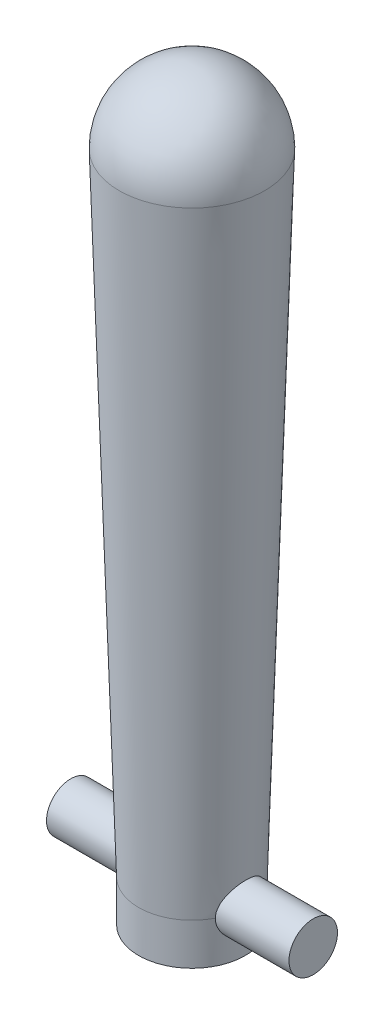
ISO-10303-21;
HEADER;
FILE_DESCRIPTION(('STEP AP214'),'2;1');
FILE_NAME('part.step','',(''),(''),'','','');
FILE_SCHEMA(('AUTOMOTIVE_DESIGN { 1 0 10303 214 1 1 1 1 }'));
ENDSEC;
DATA;
#1=APPLICATION_CONTEXT('core data for automotive mechanical design processes');
#2=APPLICATION_PROTOCOL_DEFINITION('international standard','automotive_design',2000,#1);
#3=PRODUCT_CONTEXT('',#1,'mechanical');
#4=PRODUCT('Part','Part','',(#3));
#5=PRODUCT_RELATED_PRODUCT_CATEGORY('part','',(#4));
#6=PRODUCT_DEFINITION_FORMATION('','',#4);
#7=PRODUCT_DEFINITION_CONTEXT('part definition',#1,'design');
#8=PRODUCT_DEFINITION('design','',#6,#7);
#9=PRODUCT_DEFINITION_SHAPE('','',#8);
#10=(LENGTH_UNIT() NAMED_UNIT(*) SI_UNIT(.MILLI.,.METRE.));
#11=(NAMED_UNIT(*) PLANE_ANGLE_UNIT() SI_UNIT($,.RADIAN.));
#12=(NAMED_UNIT(*) SI_UNIT($,.STERADIAN.) SOLID_ANGLE_UNIT());
#13=UNCERTAINTY_MEASURE_WITH_UNIT(LENGTH_MEASURE(1.E-05),#10,'distance_accuracy_value','');
#14=(GEOMETRIC_REPRESENTATION_CONTEXT(3) GLOBAL_UNCERTAINTY_ASSIGNED_CONTEXT((#13)) GLOBAL_UNIT_ASSIGNED_CONTEXT((#10,
#11,#12)) REPRESENTATION_CONTEXT('',''));
#15=CARTESIAN_POINT('',(0.,0.,0.));
#16=DIRECTION('',(0.,0.,1.));
#17=DIRECTION('',(1.,0.,0.));
#18=AXIS2_PLACEMENT_3D('',#15,#16,#17);
#19=CARTESIAN_POINT('',(0.,13.,0.));
#20=DIRECTION('',(0.,1.,0.));
#21=DIRECTION('',(0.,0.,1.));
#22=AXIS2_PLACEMENT_3D('',#19,#20,#21);
#23=CONICAL_SURFACE('',#22,1.5,0.0307595260704692);
#24=CARTESIAN_POINT('',(0.,0.,0.));
#25=DIRECTION('',(0.,-1.,0.));
#26=DIRECTION('',(0.,0.,-1.));
#27=AXIS2_PLACEMENT_3D('',#24,#25,#26);
#28=CIRCLE('',#27,1.1);
#29=CARTESIAN_POINT('',(0.979795897113271,0.,0.5));
#30=VERTEX_POINT('',#29);
#31=CARTESIAN_POINT('',(-0.979795897113271,0.,0.5));
#32=VERTEX_POINT('',#31);
#33=EDGE_CURVE('E74',#30,#32,#28,.T.);
#34=ORIENTED_EDGE('',*,*,#33,.F.);
#35=CARTESIAN_POINT('',(0.979789008703573,-0.000200000000000052,0.499999959999998));
#36=CARTESIAN_POINT('',(0.980667534677214,0.026673580649546,0.500038231747325));
#37=CARTESIAN_POINT('',(0.982736407767308,0.0534554576234011,0.497857494689128));
#38=CARTESIAN_POINT('',(0.988819719807875,0.105990948204609,0.489349141286335));
#39=CARTESIAN_POINT('',(0.99282420392743,0.131749101151796,0.483042685452454));
#40=CARTESIAN_POINT('',(1.00235210365275,0.18163304455214,0.466584410645878));
#41=CARTESIAN_POINT('',(1.00787263560806,0.205761826724357,0.456439878318826));
#42=CARTESIAN_POINT('',(1.01986281057453,0.251993204113202,0.432638482857176));
#43=CARTESIAN_POINT('',(1.02633374157353,0.274092982496116,0.418976834080627));
#44=CARTESIAN_POINT('',(1.04012471477174,0.317383764866355,0.387347464194292));
#45=CARTESIAN_POINT('',(1.04747222296316,0.338389156117948,0.369137366328812));
#46=CARTESIAN_POINT('',(1.06187772257956,0.377152030429552,0.32943318160678));
#47=CARTESIAN_POINT('',(1.06893566278286,0.394908940771058,0.307938516893259));
#48=CARTESIAN_POINT('',(1.08238243353826,0.427405509491734,0.261096053963776));
#49=CARTESIAN_POINT('',(1.08872927318481,0.441981991595139,0.235622049641159));
#50=CARTESIAN_POINT('',(1.09969514640404,0.466544029432697,0.182206229664489));
#51=CARTESIAN_POINT('',(1.10431528793788,0.476532530058135,0.154266010772307));
#52=CARTESIAN_POINT('',(1.11103332209182,0.490891531571009,0.0989047457140309));
#53=CARTESIAN_POINT('',(1.11329169459882,0.495621116082472,0.0715965850721061));
#54=CARTESIAN_POINT('',(1.1156181744336,0.500492034097003,0.0164862906335935));
#55=CARTESIAN_POINT('',(1.11568735913518,0.500635624524103,-0.0113155934440866));
#56=CARTESIAN_POINT('',(1.11371023422047,0.496498189579101,-0.0643707976889177));
#57=CARTESIAN_POINT('',(1.11182420343674,0.492552398299264,-0.0896573039552398));
#58=CARTESIAN_POINT('',(1.10635824311644,0.480917355131015,-0.139158427993637));
#59=CARTESIAN_POINT('',(1.10277819715677,0.473227845950314,-0.163372971968794));
#60=CARTESIAN_POINT('',(1.09415748486996,0.454215170363463,-0.210591856656948));
#61=CARTESIAN_POINT('',(1.08909045573815,0.442825984028281,-0.233564617239766));
#62=CARTESIAN_POINT('',(1.07795067995573,0.416816545865788,-0.277331381222452));
#63=CARTESIAN_POINT('',(1.07187756202203,0.402195100549636,-0.29812457564122));
#64=CARTESIAN_POINT('',(1.05864389776878,0.368648874791238,-0.338903356474766));
#65=CARTESIAN_POINT('',(1.05143467887151,0.349457572805274,-0.358654100597597));
#66=CARTESIAN_POINT('',(1.03705377117677,0.308078994201976,-0.394768532427956));
#67=CARTESIAN_POINT('',(1.02988211619054,0.285889383181641,-0.411129555591604));
#68=CARTESIAN_POINT('',(1.01589519838396,0.237628215822395,-0.440886719775832));
#69=CARTESIAN_POINT('',(1.00912272125232,0.211408453361885,-0.454064124460744));
#70=CARTESIAN_POINT('',(0.997248233290443,0.156764293535009,-0.475693286431028));
#71=CARTESIAN_POINT('',(0.992142622106944,0.128344814052058,-0.484155257178916));
#72=CARTESIAN_POINT('',(0.986027244232339,0.0829883818913498,-0.493345372452947));
#73=CARTESIAN_POINT('',(0.984203762108643,0.0665014630312679,-0.495838170076315));
#74=CARTESIAN_POINT('',(0.981369097838414,0.0332860531379635,-0.499170599798482));
#75=CARTESIAN_POINT('',(0.980358263626949,0.0165574617496968,-0.500009524014649));
#76=CARTESIAN_POINT('',(0.979789008703573,-0.000200000000000043,-0.499999959999998));
#77=B_SPLINE_CURVE_WITH_KNOTS('',3,(#35,#36,#37,#38,#39,#40,#41,#42,#43,#44,#45,#46,#47,#48,#49,
#50,#51,#52,#53,#54,#55,#56,#57,#58,#59,#60,#61,#62,#63,#64,#65,#66,#67,#68,#69,#70,#71,#72,#73,
#74,#75,#76),.UNSPECIFIED.,.F.,.F.,(4,2,2,2,2,2,2,2,2,2,2,2,2,2,2,2,2,2,2,2,4),(0.,
0.0804701934009941,0.160530863073263,0.24044029294246,0.320459033365049,0.406348158661051,
0.492252411946693,0.581861920552163,0.671413830778043,0.754381063743767,0.837307465076174,
0.91393536495801,0.990568531943865,1.06865214225941,1.1467646326992,1.23179897613393,
1.31689991065821,1.40679121519085,1.49648705395188,1.54671450645139,1.59696345239073),.UNSPECIFIED.);
#78=CARTESIAN_POINT('',(0.979795897113271,0.,-0.5));
#79=VERTEX_POINT('',#78);
#80=EDGE_CURVE('E59',#30,#79,#77,.T.);
#81=ORIENTED_EDGE('',*,*,#80,.T.);
#82=CARTESIAN_POINT('',(-0.979795897113271,0.,-0.5));
#83=VERTEX_POINT('',#82);
#84=EDGE_CURVE('E73',#83,#79,#28,.T.);
#85=ORIENTED_EDGE('',*,*,#84,.F.);
#86=CARTESIAN_POINT('',(-0.979789008703573,-0.000200000000000052,-0.499999959999998));
#87=CARTESIAN_POINT('',(-0.980667534677214,0.026673580649546,-0.500038231747325));
#88=CARTESIAN_POINT('',(-0.982736407767308,0.0534554576234011,-0.497857494689128));
#89=CARTESIAN_POINT('',(-0.988819719807875,0.105990948204609,-0.489349141286335));
#90=CARTESIAN_POINT('',(-0.99282420392743,0.131749101151796,-0.483042685452454));
#91=CARTESIAN_POINT('',(-1.00235210365275,0.18163304455214,-0.466584410645878));
#92=CARTESIAN_POINT('',(-1.00787263560806,0.205761826724357,-0.456439878318826));
#93=CARTESIAN_POINT('',(-1.01986281057453,0.251993204113202,-0.432638482857176));
#94=CARTESIAN_POINT('',(-1.02633374157353,0.274092982496116,-0.418976834080627));
#95=CARTESIAN_POINT('',(-1.04012471477174,0.317383764866355,-0.387347464194292));
#96=CARTESIAN_POINT('',(-1.04747222296316,0.338389156117948,-0.369137366328812));
#97=CARTESIAN_POINT('',(-1.06187772257956,0.377152030429552,-0.32943318160678));
#98=CARTESIAN_POINT('',(-1.06893566278286,0.394908940771058,-0.307938516893259));
#99=CARTESIAN_POINT('',(-1.08238243353826,0.427405509491734,-0.261096053963776));
#100=CARTESIAN_POINT('',(-1.08872927318481,0.441981991595139,-0.235622049641159));
#101=CARTESIAN_POINT('',(-1.09969514640404,0.466544029432697,-0.182206229664489));
#102=CARTESIAN_POINT('',(-1.10431528793788,0.476532530058135,-0.154266010772307));
#103=CARTESIAN_POINT('',(-1.11103332209182,0.490891531571009,-0.0989047457140309));
#104=CARTESIAN_POINT('',(-1.11329169459882,0.495621116082472,-0.0715965850721061));
#105=CARTESIAN_POINT('',(-1.1156181744336,0.500492034097003,-0.0164862906335935));
#106=CARTESIAN_POINT('',(-1.11568735913518,0.500635624524103,0.0113155934440866));
#107=CARTESIAN_POINT('',(-1.11371023422047,0.496498189579101,0.0643707976889177));
#108=CARTESIAN_POINT('',(-1.11182420343674,0.492552398299264,0.0896573039552398));
#109=CARTESIAN_POINT('',(-1.10635824311644,0.480917355131015,0.139158427993637));
#110=CARTESIAN_POINT('',(-1.10277819715677,0.473227845950314,0.163372971968794));
#111=CARTESIAN_POINT('',(-1.09415748486996,0.454215170363463,0.210591856656948));
#112=CARTESIAN_POINT('',(-1.08909045573815,0.442825984028281,0.233564617239766));
#113=CARTESIAN_POINT('',(-1.07795067995573,0.416816545865788,0.277331381222452));
#114=CARTESIAN_POINT('',(-1.07187756202203,0.402195100549636,0.29812457564122));
#115=CARTESIAN_POINT('',(-1.05864389776878,0.368648874791238,0.338903356474766));
#116=CARTESIAN_POINT('',(-1.05143467887151,0.349457572805274,0.358654100597597));
#117=CARTESIAN_POINT('',(-1.03705377117677,0.308078994201976,0.394768532427956));
#118=CARTESIAN_POINT('',(-1.02988211619054,0.285889383181641,0.411129555591604));
#119=CARTESIAN_POINT('',(-1.01589519838396,0.237628215822395,0.440886719775832));
#120=CARTESIAN_POINT('',(-1.00912272125232,0.211408453361885,0.454064124460744));
#121=CARTESIAN_POINT('',(-0.997248233290443,0.156764293535009,0.475693286431028));
#122=CARTESIAN_POINT('',(-0.992142622106944,0.128344814052058,0.484155257178916));
#123=CARTESIAN_POINT('',(-0.986027244232339,0.0829883818913498,0.493345372452947));
#124=CARTESIAN_POINT('',(-0.984203762108643,0.0665014630312679,0.495838170076315));
#125=CARTESIAN_POINT('',(-0.981369097838414,0.0332860531379635,0.499170599798482));
#126=CARTESIAN_POINT('',(-0.980358263626949,0.0165574617496968,0.500009524014649));
#127=CARTESIAN_POINT('',(-0.979789008703573,-0.000200000000000043,0.499999959999998));
#128=B_SPLINE_CURVE_WITH_KNOTS('',3,(#86,#87,#88,#89,#90,#91,#92,#93,#94,#95,#96,#97,#98,#99,
#100,#101,#102,#103,#104,#105,#106,#107,#108,#109,#110,#111,#112,#113,#114,#115,#116,#117,#118,
#119,#120,#121,#122,#123,#124,#125,#126,#127),.UNSPECIFIED.,.F.,.F.,(4,2,2,2,2,2,2,2,2,2,2,2,2,
2,2,2,2,2,2,2,4),(0.,0.0804701934009941,0.160530863073263,0.24044029294246,0.320459033365049,
0.406348158661051,0.492252411946693,0.581861920552163,0.671413830778043,0.754381063743767,
0.837307465076174,0.91393536495801,0.990568531943865,1.06865214225941,1.1467646326992,
1.23179897613393,1.31689991065821,1.40679121519085,1.49648705395188,1.54671450645139,
1.59696345239073),.UNSPECIFIED.);
#129=EDGE_CURVE('E53',#83,#32,#128,.T.);
#130=ORIENTED_EDGE('',*,*,#129,.T.);
#131=EDGE_LOOP('',(#34,#81,#85,#130));
#132=FACE_BOUND('',#131,.T.);
#133=CARTESIAN_POINT('',(0.,13.,0.));
#134=DIRECTION('',(0.,-1.,0.));
#135=DIRECTION('',(0.,0.,-1.));
#136=AXIS2_PLACEMENT_3D('',#133,#134,#135);
#137=CIRCLE('',#136,1.5);
#138=CARTESIAN_POINT('',(0.,13.,-1.5));
#139=VERTEX_POINT('',#138);
#140=EDGE_CURVE('E69',#139,#139,#137,.T.);
#141=ORIENTED_EDGE('',*,*,#140,.T.);
#142=EDGE_LOOP('',(#141));
#143=FACE_BOUND('',#142,.T.);
#144=ADVANCED_FACE('F35',(#132,#143),#23,.T.);
#145=CARTESIAN_POINT('',(0.,13.,0.));
#146=DIRECTION('',(0.,-1.,0.));
#147=DIRECTION('',(0.,0.,-1.));
#148=AXIS2_PLACEMENT_3D('',#145,#146,#147);
#149=SPHERICAL_SURFACE('',#148,1.5);
#150=ORIENTED_EDGE('',*,*,#140,.F.);
#151=EDGE_LOOP('',(#150));
#152=FACE_BOUND('',#151,.T.);
#153=ADVANCED_FACE('F119',(#152),#149,.T.);
#154=CARTESIAN_POINT('',(0.,-0.857830240876171,0.));
#155=DIRECTION('',(0.,1.,0.));
#156=DIRECTION('',(0.,0.,1.));
#157=AXIS2_PLACEMENT_3D('',#154,#155,#156);
#158=PLANE('',#157);
#159=CARTESIAN_POINT('',(0.,-0.857830240876171,0.));
#160=DIRECTION('',(0.,-1.,0.));
#161=DIRECTION('',(0.,0.,-1.));
#162=AXIS2_PLACEMENT_3D('',#159,#160,#161);
#163=CIRCLE('',#162,1.1);
#164=CARTESIAN_POINT('',(0.,-0.857830240876171,-1.1));
#165=VERTEX_POINT('',#164);
#166=EDGE_CURVE('E79',#165,#165,#163,.T.);
#167=ORIENTED_EDGE('',*,*,#166,.T.);
#168=EDGE_LOOP('',(#167));
#169=FACE_BOUND('',#168,.T.);
#170=ADVANCED_FACE('F123',(#169),#158,.F.);
#171=CARTESIAN_POINT('',(0.,0.,0.));
#172=DIRECTION('',(0.,-1.,0.));
#173=DIRECTION('',(0.,0.,-1.));
#174=AXIS2_PLACEMENT_3D('',#171,#172,#173);
#175=CYLINDRICAL_SURFACE('',#174,1.1);
#176=ORIENTED_EDGE('',*,*,#166,.F.);
#177=EDGE_LOOP('',(#176));
#178=FACE_BOUND('',#177,.T.);
#179=ORIENTED_EDGE('',*,*,#33,.T.);
#180=CARTESIAN_POINT('',(-0.979795897113271,0.,-0.5));
#181=CARTESIAN_POINT('',(-0.979799400643403,0.0264089718307021,-0.499996622427563));
#182=CARTESIAN_POINT('',(-0.980879324881355,0.0528494309092461,-0.497894600056735));
#183=CARTESIAN_POINT('',(-0.985055844499532,0.104951434577403,-0.489576362378013));
#184=CARTESIAN_POINT('',(-0.988157406516696,0.130610897533244,-0.483350014063128));
#185=CARTESIAN_POINT('',(-0.995945155466446,0.180295814548535,-0.467090426648929));
#186=CARTESIAN_POINT('',(-1.00062403449257,0.204328201343475,-0.457074718418302));
#187=CARTESIAN_POINT('',(-1.01102870748916,0.250365929551075,-0.433572937621822));
#188=CARTESIAN_POINT('',(-1.01675439055971,0.272371485318073,-0.420087232610751));
#189=CARTESIAN_POINT('',(-1.0290825123787,0.315378886374388,-0.388956952293501));
#190=CARTESIAN_POINT('',(-1.03571805013926,0.336212501415534,-0.371092969909922));
#191=CARTESIAN_POINT('',(-1.04884865306361,0.374715301163221,-0.332172029788939));
#192=CARTESIAN_POINT('',(-1.05534365666873,0.392383122867909,-0.311113703928206));
#193=CARTESIAN_POINT('',(-1.06787697631236,0.424970229034304,-0.265024809994194));
#194=CARTESIAN_POINT('',(-1.07387242871158,0.439692539556318,-0.239842239776741));
#195=CARTESIAN_POINT('',(-1.08431563994924,0.464616997628805,-0.187035098835594));
#196=CARTESIAN_POINT('',(-1.08876420996875,0.474821515067474,-0.159411817574624));
#197=CARTESIAN_POINT('',(-1.09537615851834,0.489786866982109,-0.104280905428518));
#198=CARTESIAN_POINT('',(-1.09766159388596,0.494839899508645,-0.076867544067744));
#199=CARTESIAN_POINT('',(-1.10013846672466,0.500310896081855,-0.0214934996995693));
#200=CARTESIAN_POINT('',(-1.10033092794564,0.500731126202328,0.00646690902146904));
#201=CARTESIAN_POINT('',(-1.09866607366637,0.497060394631644,0.0599860323450828));
#202=CARTESIAN_POINT('',(-1.09695570450032,0.493292852943808,0.085572431931501));
#203=CARTESIAN_POINT('',(-1.09188806335006,0.481918426727474,0.135703323705562));
#204=CARTESIAN_POINT('',(-1.08853066924739,0.474311257509043,0.160247738488725));
#205=CARTESIAN_POINT('',(-1.08042197280608,0.455395993642856,0.208051850365565));
#206=CARTESIAN_POINT('',(-1.07565034790292,0.444033641919214,0.231286489014201));
#207=CARTESIAN_POINT('',(-1.06516406917256,0.417990933258537,0.275579994624468));
#208=CARTESIAN_POINT('',(-1.05944907014821,0.403309361030938,0.296638060536099));
#209=CARTESIAN_POINT('',(-1.04708369559818,0.369660097742397,0.337808585072427));
#210=CARTESIAN_POINT('',(-1.04039504721411,0.350440541145151,0.357703952157719));
#211=CARTESIAN_POINT('',(-1.02716391006717,0.308953150794929,0.394093866112698));
#212=CARTESIAN_POINT('',(-1.0206215023412,0.286683673412867,0.410586567161527));
#213=CARTESIAN_POINT('',(-1.00811991523669,0.238476020143765,0.440418027576735));
#214=CARTESIAN_POINT('',(-1.00220047589901,0.212417500004225,0.453580487192936));
#215=CARTESIAN_POINT('',(-0.992115189307178,0.158115867938542,0.475238669662362));
#216=CARTESIAN_POINT('',(-0.987947818113588,0.129874679905943,0.483738450058658));
#217=CARTESIAN_POINT('',(-0.982239338431755,0.0741887158259867,0.495221574952328));
#218=CARTESIAN_POINT('',(-0.980529465593092,0.0468350756420298,0.498560745642876));
#219=CARTESIAN_POINT('',(-0.979445338405849,-0.0080893188842497,0.500688356005489));
#220=CARTESIAN_POINT('',(-0.980069980730163,-0.0356599645198214,0.499478945404025));
#221=CARTESIAN_POINT('',(-0.983407681190215,-0.0878273067816509,0.492869690773844));
#222=CARTESIAN_POINT('',(-0.985944234768316,-0.112481731112118,0.487823706484427));
#223=CARTESIAN_POINT('',(-0.992578812021475,-0.160563038970523,0.474177620805957));
#224=CARTESIAN_POINT('',(-0.996677250902089,-0.183989594201131,0.465576574301419));
#225=CARTESIAN_POINT('',(-1.00619750281658,-0.230146094479776,0.444639291917865));
#226=CARTESIAN_POINT('',(-1.01167094228178,-0.252796148968439,0.432151228987456));
#227=CARTESIAN_POINT('',(-1.0232633462328,-0.295799840220151,0.403936350897303));
#228=CARTESIAN_POINT('',(-1.02938262115173,-0.316152362814006,0.388207974729641));
#229=CARTESIAN_POINT('',(-1.04231637963309,-0.356112522374895,0.352107143079347));
#230=CARTESIAN_POINT('',(-1.0491390535915,-0.375440893469577,0.331427175304508));
#231=CARTESIAN_POINT('',(-1.06215836420605,-0.410419645310274,0.286976587275012));
#232=CARTESIAN_POINT('',(-1.06835489379005,-0.426069397608739,0.263205440005546));
#233=CARTESIAN_POINT('',(-1.07952645040211,-0.453358993328852,0.21282585373438));
#234=CARTESIAN_POINT('',(-1.08448705512169,-0.464952077467173,0.186188679620793));
#235=CARTESIAN_POINT('',(-1.0925193382509,-0.483392182537091,0.131054392194264));
#236=CARTESIAN_POINT('',(-1.09559237750373,-0.49024262313873,0.102558635263905));
#237=CARTESIAN_POINT('',(-1.09932027522983,-0.49851503601315,0.0469864706280775));
#238=CARTESIAN_POINT('',(-1.10014946975576,-0.500328677649455,0.0199797854293609));
#239=CARTESIAN_POINT('',(-1.09980613600984,-0.499573651205913,-0.033955943046195));
#240=CARTESIAN_POINT('',(-1.09863408956314,-0.497006037970998,-0.0608850034486617));
#241=CARTESIAN_POINT('',(-1.09451876393578,-0.487838888933775,-0.112556799742096));
#242=CARTESIAN_POINT('',(-1.09166304497866,-0.481438439292179,-0.137342468202769));
#243=CARTESIAN_POINT('',(-1.08452511391052,-0.465025983076814,-0.185465674994973));
#244=CARTESIAN_POINT('',(-1.08024265982569,-0.455013363856363,-0.208802966885304));
#245=CARTESIAN_POINT('',(-1.07040934249672,-0.431160581200045,-0.254551204315484));
#246=CARTESIAN_POINT('',(-1.06480942909593,-0.41716631818753,-0.276870979385234));
#247=CARTESIAN_POINT('',(-1.05297360283667,-0.3859556962774,-0.318943614621682));
#248=CARTESIAN_POINT('',(-1.04673741256756,-0.36873792920763,-0.33869534653708));
#249=CARTESIAN_POINT('',(-1.03367044726807,-0.329902859727398,-0.376780505202841));
#250=CARTESIAN_POINT('',(-1.02683314139757,-0.30803950785299,-0.394861655352156));
#251=CARTESIAN_POINT('',(-1.01382370658139,-0.261416693303509,-0.427160020122078));
#252=CARTESIAN_POINT('',(-1.0076520176935,-0.236655336958356,-0.441374687840734));
#253=CARTESIAN_POINT('',(-0.996706085758763,-0.184594514270462,-0.465569971695474));
#254=CARTESIAN_POINT('',(-0.991943348434895,-0.15727642638434,-0.475516010938143));
#255=CARTESIAN_POINT('',(-0.984609768511834,-0.101107543563138,-0.490526305375875));
#256=CARTESIAN_POINT('',(-0.982031571767527,-0.0722622412327644,-0.495606947267287));
#257=CARTESIAN_POINT('',(-0.980112943777413,-0.0288280486319526,-0.499378099006954));
#258=CARTESIAN_POINT('',(-0.979793984262931,-0.0144187173637797,-0.500001844080211));
#259=CARTESIAN_POINT('',(-0.979795897113271,0.,-0.5));
#260=B_SPLINE_CURVE_WITH_KNOTS('',3,(#180,#181,#182,#183,#184,#185,#186,#187,#188,#189,#190,
#191,#192,#193,#194,#195,#196,#197,#198,#199,#200,#201,#202,#203,#204,#205,#206,#207,#208,#209,
#210,#211,#212,#213,#214,#215,#216,#217,#218,#219,#220,#221,#222,#223,#224,#225,#226,#227,#228,
#229,#230,#231,#232,#233,#234,#235,#236,#237,#238,#239,#240,#241,#242,#243,#244,#245,#246,#247,
#248,#249,#250,#251,#252,#253,#254,#255,#256,#257,#258,#259),.UNSPECIFIED.,.T.,.F.,(4,2,2,2,2,2,
2,2,2,2,2,2,2,2,2,2,2,2,2,2,2,2,2,2,2,2,2,2,2,2,2,2,2,2,2,2,2,2,2,4),(0.,0.079179796058053,
0.158554853157823,0.237567097608837,0.316570976235983,0.400911928421181,0.485289105995261,
0.574168769708285,0.663001754620379,0.746455988956675,0.829869400949851,0.907262191101826,
0.984660720400477,1.0632303671361,1.14182882787605,1.22683578448053,1.31188873367681,
1.40078692465031,1.48960763168007,1.57197719141409,1.65430782697473,1.729847733631,
1.80540773554813,1.88439758830222,1.96342558345906,2.05037690422791,2.13734306880014,
2.22528096457904,2.31315538675571,2.39397479998293,2.47477475761523,2.55170315235348,
2.62864460077018,2.70910470577483,2.78960004174917,2.87675053686528,2.96395830087682,
3.05185971427619,3.1394640228372,3.18269444875464),.UNSPECIFIED.);
#261=EDGE_CURVE('E11',#32,#83,#260,.T.);
#262=ORIENTED_EDGE('',*,*,#261,.T.);
#263=ORIENTED_EDGE('',*,*,#84,.T.);
#264=CARTESIAN_POINT('',(0.979795897113271,0.,-0.5));
#265=CARTESIAN_POINT('',(0.979799400643403,-0.0264089718307021,-0.499996622427563));
#266=CARTESIAN_POINT('',(0.980879324881355,-0.0528494309092461,-0.497894600056735));
#267=CARTESIAN_POINT('',(0.985055844499532,-0.104951434577403,-0.489576362378013));
#268=CARTESIAN_POINT('',(0.988157406516696,-0.130610897533244,-0.483350014063128));
#269=CARTESIAN_POINT('',(0.995945155466446,-0.180295814548535,-0.467090426648929));
#270=CARTESIAN_POINT('',(1.00062403449257,-0.204328201343475,-0.457074718418302));
#271=CARTESIAN_POINT('',(1.01102870748916,-0.250365929551075,-0.433572937621822));
#272=CARTESIAN_POINT('',(1.01675439055971,-0.272371485318073,-0.420087232610751));
#273=CARTESIAN_POINT('',(1.0290825123787,-0.315378886374388,-0.388956952293501));
#274=CARTESIAN_POINT('',(1.03571805013926,-0.336212501415534,-0.371092969909922));
#275=CARTESIAN_POINT('',(1.04884865306361,-0.374715301163221,-0.332172029788939));
#276=CARTESIAN_POINT('',(1.05534365666873,-0.392383122867909,-0.311113703928206));
#277=CARTESIAN_POINT('',(1.06787697631236,-0.424970229034304,-0.265024809994194));
#278=CARTESIAN_POINT('',(1.07387242871158,-0.439692539556318,-0.239842239776741));
#279=CARTESIAN_POINT('',(1.08431563994924,-0.464616997628805,-0.187035098835594));
#280=CARTESIAN_POINT('',(1.08876420996875,-0.474821515067474,-0.159411817574624));
#281=CARTESIAN_POINT('',(1.09537615851834,-0.489786866982109,-0.104280905428518));
#282=CARTESIAN_POINT('',(1.09766159388596,-0.494839899508645,-0.076867544067744));
#283=CARTESIAN_POINT('',(1.10013846672466,-0.500310896081855,-0.0214934996995693));
#284=CARTESIAN_POINT('',(1.10033092794564,-0.500731126202328,0.00646690902146904));
#285=CARTESIAN_POINT('',(1.09866607366637,-0.497060394631644,0.0599860323450828));
#286=CARTESIAN_POINT('',(1.09695570450032,-0.493292852943808,0.085572431931501));
#287=CARTESIAN_POINT('',(1.09188806335006,-0.481918426727474,0.135703323705562));
#288=CARTESIAN_POINT('',(1.08853066924739,-0.474311257509043,0.160247738488725));
#289=CARTESIAN_POINT('',(1.08042197280608,-0.455395993642856,0.208051850365565));
#290=CARTESIAN_POINT('',(1.07565034790292,-0.444033641919214,0.231286489014201));
#291=CARTESIAN_POINT('',(1.06516406917256,-0.417990933258537,0.275579994624468));
#292=CARTESIAN_POINT('',(1.05944907014821,-0.403309361030938,0.296638060536099));
#293=CARTESIAN_POINT('',(1.04708369559818,-0.369660097742397,0.337808585072427));
#294=CARTESIAN_POINT('',(1.04039504721411,-0.350440541145151,0.357703952157719));
#295=CARTESIAN_POINT('',(1.02716391006717,-0.308953150794929,0.394093866112698));
#296=CARTESIAN_POINT('',(1.0206215023412,-0.286683673412867,0.410586567161527));
#297=CARTESIAN_POINT('',(1.00811991523669,-0.238476020143765,0.440418027576735));
#298=CARTESIAN_POINT('',(1.00220047589901,-0.212417500004225,0.453580487192936));
#299=CARTESIAN_POINT('',(0.992115189307178,-0.158115867938542,0.475238669662362));
#300=CARTESIAN_POINT('',(0.987947818113588,-0.129874679905943,0.483738450058658));
#301=CARTESIAN_POINT('',(0.982239338431755,-0.0741887158259867,0.495221574952328));
#302=CARTESIAN_POINT('',(0.980529465593092,-0.0468350756420298,0.498560745642876));
#303=CARTESIAN_POINT('',(0.979445338405849,0.0080893188842497,0.500688356005489));
#304=CARTESIAN_POINT('',(0.980069980730163,0.0356599645198214,0.499478945404025));
#305=CARTESIAN_POINT('',(0.983407681190215,0.0878273067816509,0.492869690773844));
#306=CARTESIAN_POINT('',(0.985944234768316,0.112481731112118,0.487823706484427));
#307=CARTESIAN_POINT('',(0.992578812021475,0.160563038970523,0.474177620805957));
#308=CARTESIAN_POINT('',(0.996677250902089,0.183989594201131,0.465576574301419));
#309=CARTESIAN_POINT('',(1.00619750281658,0.230146094479776,0.444639291917865));
#310=CARTESIAN_POINT('',(1.01167094228178,0.252796148968439,0.432151228987456));
#311=CARTESIAN_POINT('',(1.0232633462328,0.295799840220151,0.403936350897303));
#312=CARTESIAN_POINT('',(1.02938262115173,0.316152362814006,0.388207974729641));
#313=CARTESIAN_POINT('',(1.04231637963309,0.356112522374895,0.352107143079347));
#314=CARTESIAN_POINT('',(1.0491390535915,0.375440893469577,0.331427175304508));
#315=CARTESIAN_POINT('',(1.06215836420605,0.410419645310274,0.286976587275012));
#316=CARTESIAN_POINT('',(1.06835489379005,0.426069397608739,0.263205440005546));
#317=CARTESIAN_POINT('',(1.07952645040211,0.453358993328852,0.21282585373438));
#318=CARTESIAN_POINT('',(1.08448705512169,0.464952077467173,0.186188679620793));
#319=CARTESIAN_POINT('',(1.0925193382509,0.483392182537091,0.131054392194264));
#320=CARTESIAN_POINT('',(1.09559237750373,0.49024262313873,0.102558635263905));
#321=CARTESIAN_POINT('',(1.09932027522983,0.49851503601315,0.0469864706280775));
#322=CARTESIAN_POINT('',(1.10014946975576,0.500328677649455,0.0199797854293609));
#323=CARTESIAN_POINT('',(1.09980613600984,0.499573651205913,-0.033955943046195));
#324=CARTESIAN_POINT('',(1.09863408956314,0.497006037970998,-0.0608850034486617));
#325=CARTESIAN_POINT('',(1.09451876393578,0.487838888933775,-0.112556799742096));
#326=CARTESIAN_POINT('',(1.09166304497866,0.481438439292179,-0.137342468202769));
#327=CARTESIAN_POINT('',(1.08452511391052,0.465025983076814,-0.185465674994973));
#328=CARTESIAN_POINT('',(1.08024265982569,0.455013363856363,-0.208802966885304));
#329=CARTESIAN_POINT('',(1.07040934249672,0.431160581200045,-0.254551204315484));
#330=CARTESIAN_POINT('',(1.06480942909593,0.41716631818753,-0.276870979385234));
#331=CARTESIAN_POINT('',(1.05297360283667,0.3859556962774,-0.318943614621682));
#332=CARTESIAN_POINT('',(1.04673741256756,0.36873792920763,-0.33869534653708));
#333=CARTESIAN_POINT('',(1.03367044726807,0.329902859727398,-0.376780505202841));
#334=CARTESIAN_POINT('',(1.02683314139757,0.30803950785299,-0.394861655352156));
#335=CARTESIAN_POINT('',(1.01382370658139,0.261416693303509,-0.427160020122078));
#336=CARTESIAN_POINT('',(1.0076520176935,0.236655336958356,-0.441374687840734));
#337=CARTESIAN_POINT('',(0.996706085758763,0.184594514270462,-0.465569971695474));
#338=CARTESIAN_POINT('',(0.991943348434895,0.15727642638434,-0.475516010938143));
#339=CARTESIAN_POINT('',(0.984609768511834,0.101107543563138,-0.490526305375875));
#340=CARTESIAN_POINT('',(0.982031571767527,0.0722622412327644,-0.495606947267287));
#341=CARTESIAN_POINT('',(0.980112943777413,0.0288280486319526,-0.499378099006954));
#342=CARTESIAN_POINT('',(0.979793984262931,0.0144187173637797,-0.500001844080211));
#343=CARTESIAN_POINT('',(0.979795897113271,0.,-0.5));
#344=B_SPLINE_CURVE_WITH_KNOTS('',3,(#264,#265,#266,#267,#268,#269,#270,#271,#272,#273,#274,
#275,#276,#277,#278,#279,#280,#281,#282,#283,#284,#285,#286,#287,#288,#289,#290,#291,#292,#293,
#294,#295,#296,#297,#298,#299,#300,#301,#302,#303,#304,#305,#306,#307,#308,#309,#310,#311,#312,
#313,#314,#315,#316,#317,#318,#319,#320,#321,#322,#323,#324,#325,#326,#327,#328,#329,#330,#331,
#332,#333,#334,#335,#336,#337,#338,#339,#340,#341,#342,#343),.UNSPECIFIED.,.T.,.F.,(4,2,2,2,2,2,
2,2,2,2,2,2,2,2,2,2,2,2,2,2,2,2,2,2,2,2,2,2,2,2,2,2,2,2,2,2,2,2,2,4),(0.,0.079179796058053,
0.158554853157823,0.237567097608837,0.316570976235983,0.400911928421181,0.485289105995261,
0.574168769708285,0.663001754620379,0.746455988956675,0.829869400949851,0.907262191101826,
0.984660720400477,1.0632303671361,1.14182882787605,1.22683578448053,1.31188873367681,
1.40078692465031,1.48960763168007,1.57197719141409,1.65430782697473,1.729847733631,
1.80540773554813,1.88439758830222,1.96342558345906,2.05037690422791,2.13734306880014,
2.22528096457904,2.31315538675571,2.39397479998293,2.47477475761523,2.55170315235348,
2.62864460077018,2.70910470577483,2.78960004174917,2.87675053686528,2.96395830087682,
3.05185971427619,3.1394640228372,3.18269444875464),.UNSPECIFIED.);
#345=EDGE_CURVE('E47',#79,#30,#344,.T.);
#346=ORIENTED_EDGE('',*,*,#345,.T.);
#347=EDGE_LOOP('',(#179,#262,#263,#346));
#348=FACE_BOUND('',#347,.T.);
#349=ADVANCED_FACE('F77',(#178,#348),#175,.T.);
#350=CARTESIAN_POINT('',(2.5,0.,0.));
#351=DIRECTION('',(1.,0.,0.));
#352=DIRECTION('',(0.,0.,-1.));
#353=AXIS2_PLACEMENT_3D('',#350,#351,#352);
#354=PLANE('',#353);
#355=CARTESIAN_POINT('',(2.5,0.,0.));
#356=DIRECTION('',(1.,0.,0.));
#357=DIRECTION('',(0.,0.,-1.));
#358=AXIS2_PLACEMENT_3D('',#355,#356,#357);
#359=CIRCLE('',#358,0.5);
#360=CARTESIAN_POINT('',(2.5,0.,-0.5));
#361=VERTEX_POINT('',#360);
#362=EDGE_CURVE('E108',#361,#361,#359,.T.);
#363=ORIENTED_EDGE('',*,*,#362,.T.);
#364=EDGE_LOOP('',(#363));
#365=FACE_BOUND('',#364,.T.);
#366=ADVANCED_FACE('F112',(#365),#354,.T.);
#367=CARTESIAN_POINT('',(-2.5,0.,0.));
#368=DIRECTION('',(1.,0.,0.));
#369=DIRECTION('',(0.,0.,-1.));
#370=AXIS2_PLACEMENT_3D('',#367,#368,#369);
#371=CYLINDRICAL_SURFACE('',#370,0.5);
#372=ORIENTED_EDGE('',*,*,#362,.F.);
#373=EDGE_LOOP('',(#372));
#374=FACE_BOUND('',#373,.T.);
#375=ORIENTED_EDGE('',*,*,#80,.F.);
#376=ORIENTED_EDGE('',*,*,#345,.F.);
#377=EDGE_LOOP('',(#375,#376));
#378=FACE_BOUND('',#377,.T.);
#379=ADVANCED_FACE('F64',(#374,#378),#371,.T.);
#380=CARTESIAN_POINT('',(-2.5,0.,0.));
#381=DIRECTION('',(1.,0.,0.));
#382=DIRECTION('',(0.,0.,-1.));
#383=AXIS2_PLACEMENT_3D('',#380,#381,#382);
#384=CIRCLE('',#383,0.5);
#385=CARTESIAN_POINT('',(-2.5,0.,-0.5));
#386=VERTEX_POINT('',#385);
#387=EDGE_CURVE('E75',#386,#386,#384,.T.);
#388=ORIENTED_EDGE('',*,*,#387,.T.);
#389=EDGE_LOOP('',(#388));
#390=FACE_BOUND('',#389,.T.);
#391=ORIENTED_EDGE('',*,*,#129,.F.);
#392=ORIENTED_EDGE('',*,*,#261,.F.);
#393=EDGE_LOOP('',(#391,#392));
#394=FACE_BOUND('',#393,.T.);
#395=ADVANCED_FACE('F92',(#390,#394),#371,.T.);
#396=CARTESIAN_POINT('',(-2.5,0.,0.));
#397=DIRECTION('',(1.,0.,0.));
#398=DIRECTION('',(0.,0.,-1.));
#399=AXIS2_PLACEMENT_3D('',#396,#397,#398);
#400=PLANE('',#399);
#401=ORIENTED_EDGE('',*,*,#387,.F.);
#402=EDGE_LOOP('',(#401));
#403=FACE_BOUND('',#402,.T.);
#404=ADVANCED_FACE('F96',(#403),#400,.F.);
#405=CLOSED_SHELL('',(#144,#153,#170,#349,#366,#379,#395,#404));
#406=MANIFOLD_SOLID_BREP('B2',#405);
#407=ADVANCED_BREP_SHAPE_REPRESENTATION('',(#18,#406),#14);
#408=SHAPE_DEFINITION_REPRESENTATION(#9,#407);
ENDSEC;
END-ISO-10303-21;
